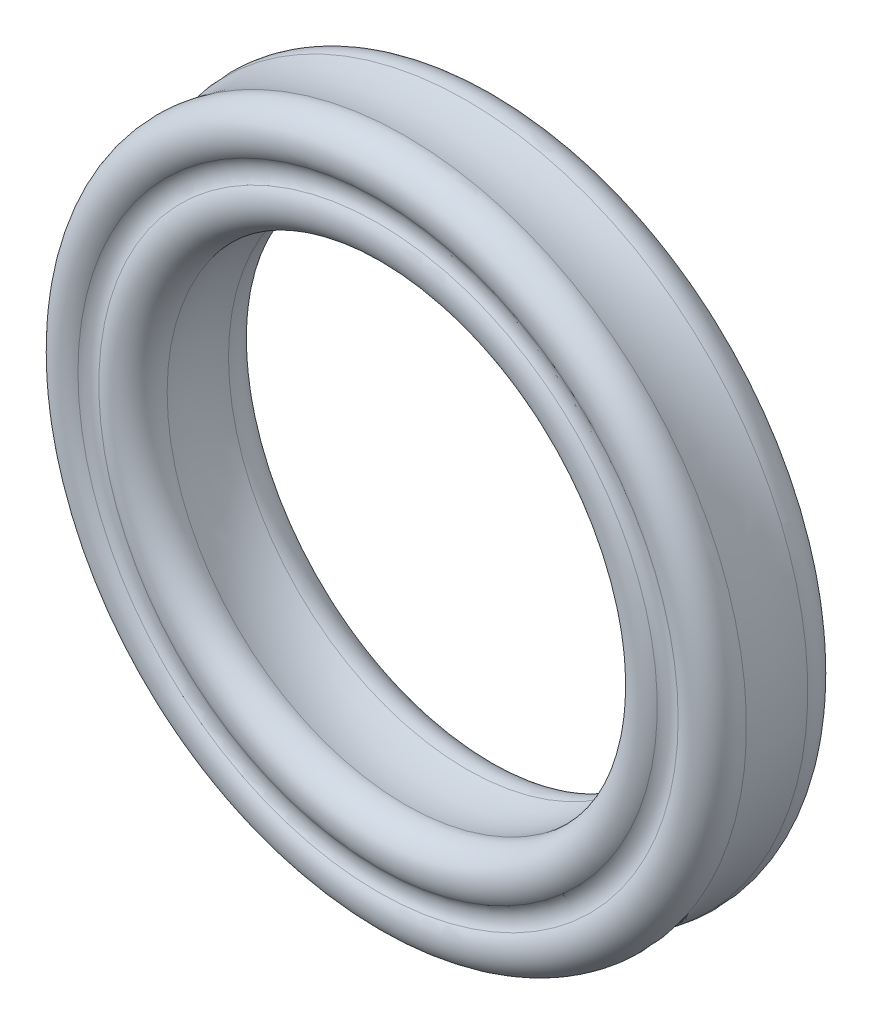
ISO-10303-21;
HEADER;
FILE_DESCRIPTION(('STEP AP214'),'2;1');
FILE_NAME('part.step','',(''),(''),'','','');
FILE_SCHEMA(('AUTOMOTIVE_DESIGN { 1 0 10303 214 1 1 1 1 }'));
ENDSEC;
DATA;
#1=APPLICATION_CONTEXT('core data for automotive mechanical design processes');
#2=APPLICATION_PROTOCOL_DEFINITION('international standard','automotive_design',2000,#1);
#3=PRODUCT_CONTEXT('',#1,'mechanical');
#4=PRODUCT('Part','Part','',(#3));
#5=PRODUCT_RELATED_PRODUCT_CATEGORY('part','',(#4));
#6=PRODUCT_DEFINITION_FORMATION('','',#4);
#7=PRODUCT_DEFINITION_CONTEXT('part definition',#1,'design');
#8=PRODUCT_DEFINITION('design','',#6,#7);
#9=PRODUCT_DEFINITION_SHAPE('','',#8);
#10=(LENGTH_UNIT() NAMED_UNIT(*) SI_UNIT(.MILLI.,.METRE.));
#11=(NAMED_UNIT(*) PLANE_ANGLE_UNIT() SI_UNIT($,.RADIAN.));
#12=(NAMED_UNIT(*) SI_UNIT($,.STERADIAN.) SOLID_ANGLE_UNIT());
#13=UNCERTAINTY_MEASURE_WITH_UNIT(LENGTH_MEASURE(1.E-05),#10,'distance_accuracy_value','');
#14=(GEOMETRIC_REPRESENTATION_CONTEXT(3) GLOBAL_UNCERTAINTY_ASSIGNED_CONTEXT((#13)) GLOBAL_UNIT_ASSIGNED_CONTEXT((#10,
#11,#12)) REPRESENTATION_CONTEXT('',''));
#15=CARTESIAN_POINT('',(0.,0.,0.));
#16=DIRECTION('',(0.,0.,1.));
#17=DIRECTION('',(1.,0.,0.));
#18=AXIS2_PLACEMENT_3D('',#15,#16,#17);
#19=CARTESIAN_POINT('',(0.,0.,0.199999999999999));
#20=DIRECTION('',(0.,0.,1.));
#21=DIRECTION('',(0.,-1.,0.));
#22=AXIS2_PLACEMENT_3D('',#19,#20,#21);
#23=TOROIDAL_SURFACE('',#22,6.65,0.4);
#24=CARTESIAN_POINT('',(0.,0.,-0.120000000000002));
#25=DIRECTION('',(0.,0.,1.));
#26=DIRECTION('',(0.,-1.,0.));
#27=AXIS2_PLACEMENT_3D('',#24,#25,#26);
#28=CIRCLE('',#27,6.41);
#29=CARTESIAN_POINT('',(0.,-6.41,-0.120000000000003));
#30=VERTEX_POINT('',#29);
#31=EDGE_CURVE('E10',#30,#30,#28,.T.);
#32=ORIENTED_EDGE('',*,*,#31,.F.);
#33=EDGE_LOOP('',(#32));
#34=FACE_BOUND('',#33,.T.);
#35=CARTESIAN_POINT('',(0.,0.,-0.120000000000002));
#36=DIRECTION('',(0.,0.,1.));
#37=DIRECTION('',(0.,-1.,0.));
#38=AXIS2_PLACEMENT_3D('',#35,#36,#37);
#39=CIRCLE('',#38,6.89);
#40=CARTESIAN_POINT('',(0.,-6.89,-0.120000000000003));
#41=VERTEX_POINT('',#40);
#42=EDGE_CURVE('E53',#41,#41,#39,.T.);
#43=ORIENTED_EDGE('',*,*,#42,.T.);
#44=EDGE_LOOP('',(#43));
#45=FACE_BOUND('',#44,.T.);
#46=ADVANCED_FACE('F25',(#34,#45),#23,.F.);
#47=CARTESIAN_POINT('',(0.,0.,-0.600000000000003));
#48=DIRECTION('',(0.,0.,1.));
#49=DIRECTION('',(0.,-1.,0.));
#50=AXIS2_PLACEMENT_3D('',#47,#48,#49);
#51=TOROIDAL_SURFACE('',#50,6.05,0.599999999999999);
#52=CARTESIAN_POINT('',(0.,0.,-0.745714285714287));
#53=DIRECTION('',(0.,0.,1.));
#54=DIRECTION('',(0.,-1.,0.));
#55=AXIS2_PLACEMENT_3D('',#52,#53,#54);
#56=CIRCLE('',#55,5.4679627615532);
#57=CARTESIAN_POINT('',(0.,-5.4679627615532,-0.745714285714288));
#58=VERTEX_POINT('',#57);
#59=EDGE_CURVE('E31',#58,#58,#56,.T.);
#60=ORIENTED_EDGE('',*,*,#59,.F.);
#61=EDGE_LOOP('',(#60));
#62=FACE_BOUND('',#61,.T.);
#63=ORIENTED_EDGE('',*,*,#31,.T.);
#64=EDGE_LOOP('',(#63));
#65=FACE_BOUND('',#64,.T.);
#66=ADVANCED_FACE('F90',(#62,#65),#51,.T.);
#67=CARTESIAN_POINT('',(0.,0.,-1.45));
#68=DIRECTION('',(0.,0.,1.));
#69=DIRECTION('',(0.,-1.,0.));
#70=AXIS2_PLACEMENT_3D('',#67,#68,#69);
#71=DEGENERATE_TOROIDAL_SURFACE('',#70,2.65478277572701,2.9,.T.);
#72=CARTESIAN_POINT('',(0.,0.,-2.15428571428572));
#73=DIRECTION('',(0.,0.,1.));
#74=DIRECTION('',(0.,-1.,0.));
#75=AXIS2_PLACEMENT_3D('',#72,#73,#74);
#76=CIRCLE('',#75,5.4679627615532);
#77=CARTESIAN_POINT('',(0.,-5.4679627615532,-2.15428571428572));
#78=VERTEX_POINT('',#77);
#79=EDGE_CURVE('E35',#78,#78,#76,.T.);
#80=ORIENTED_EDGE('',*,*,#79,.F.);
#81=EDGE_LOOP('',(#80));
#82=FACE_BOUND('',#81,.T.);
#83=ORIENTED_EDGE('',*,*,#59,.T.);
#84=EDGE_LOOP('',(#83));
#85=FACE_BOUND('',#84,.T.);
#86=ADVANCED_FACE('F85',(#82,#85),#71,.F.);
#87=CARTESIAN_POINT('',(0.,0.,-2.3));
#88=DIRECTION('',(0.,0.,1.));
#89=DIRECTION('',(0.,-1.,0.));
#90=AXIS2_PLACEMENT_3D('',#87,#88,#89);
#91=TOROIDAL_SURFACE('',#90,6.05,0.599999999999999);
#92=CARTESIAN_POINT('',(0.,0.,-2.78));
#93=DIRECTION('',(0.,0.,1.));
#94=DIRECTION('',(0.,-1.,0.));
#95=AXIS2_PLACEMENT_3D('',#92,#93,#94);
#96=CIRCLE('',#95,6.41);
#97=CARTESIAN_POINT('',(0.,-6.41,-2.78000000000001));
#98=VERTEX_POINT('',#97);
#99=EDGE_CURVE('E39',#98,#98,#96,.T.);
#100=ORIENTED_EDGE('',*,*,#99,.F.);
#101=EDGE_LOOP('',(#100));
#102=FACE_BOUND('',#101,.T.);
#103=ORIENTED_EDGE('',*,*,#79,.T.);
#104=EDGE_LOOP('',(#103));
#105=FACE_BOUND('',#104,.T.);
#106=ADVANCED_FACE('F79',(#102,#105),#91,.T.);
#107=CARTESIAN_POINT('',(0.,0.,-3.10000000000001));
#108=DIRECTION('',(0.,0.,1.));
#109=DIRECTION('',(0.,-1.,0.));
#110=AXIS2_PLACEMENT_3D('',#107,#108,#109);
#111=TOROIDAL_SURFACE('',#110,6.65,0.399999999999999);
#112=CARTESIAN_POINT('',(0.,0.,-2.78));
#113=DIRECTION('',(0.,0.,1.));
#114=DIRECTION('',(0.,-1.,0.));
#115=AXIS2_PLACEMENT_3D('',#112,#113,#114);
#116=CIRCLE('',#115,6.89);
#117=CARTESIAN_POINT('',(0.,-6.89,-2.78000000000001));
#118=VERTEX_POINT('',#117);
#119=EDGE_CURVE('E44',#118,#118,#116,.T.);
#120=ORIENTED_EDGE('',*,*,#119,.F.);
#121=EDGE_LOOP('',(#120));
#122=FACE_BOUND('',#121,.T.);
#123=ORIENTED_EDGE('',*,*,#99,.T.);
#124=EDGE_LOOP('',(#123));
#125=FACE_BOUND('',#124,.T.);
#126=ADVANCED_FACE('F73',(#122,#125),#111,.F.);
#127=CARTESIAN_POINT('',(0.,0.,-2.3));
#128=DIRECTION('',(0.,0.,1.));
#129=DIRECTION('',(0.,-1.,0.));
#130=AXIS2_PLACEMENT_3D('',#127,#128,#129);
#131=TOROIDAL_SURFACE('',#130,7.24999999999999,0.6);
#132=CARTESIAN_POINT('',(0.,0.,-2.15428571428572));
#133=DIRECTION('',(0.,0.,1.));
#134=DIRECTION('',(0.,-1.,0.));
#135=AXIS2_PLACEMENT_3D('',#132,#133,#134);
#136=CIRCLE('',#135,7.83203723844679);
#137=CARTESIAN_POINT('',(0.,-7.83203723844679,-2.15428571428572));
#138=VERTEX_POINT('',#137);
#139=EDGE_CURVE('E47',#138,#138,#136,.T.);
#140=ORIENTED_EDGE('',*,*,#139,.F.);
#141=EDGE_LOOP('',(#140));
#142=FACE_BOUND('',#141,.T.);
#143=ORIENTED_EDGE('',*,*,#119,.T.);
#144=EDGE_LOOP('',(#143));
#145=FACE_BOUND('',#144,.T.);
#146=ADVANCED_FACE('F67',(#142,#145),#131,.T.);
#147=CARTESIAN_POINT('',(0.,0.,-1.45));
#148=DIRECTION('',(0.,0.,1.));
#149=DIRECTION('',(0.,-1.,0.));
#150=AXIS2_PLACEMENT_3D('',#147,#148,#149);
#151=TOROIDAL_SURFACE('',#150,10.645217224273,2.9);
#152=CARTESIAN_POINT('',(0.,0.,-0.745714285714287));
#153=DIRECTION('',(0.,0.,1.));
#154=DIRECTION('',(0.,-1.,0.));
#155=AXIS2_PLACEMENT_3D('',#152,#153,#154);
#156=CIRCLE('',#155,7.83203723844679);
#157=CARTESIAN_POINT('',(0.,-7.83203723844679,-0.745714285714288));
#158=VERTEX_POINT('',#157);
#159=EDGE_CURVE('E50',#158,#158,#156,.T.);
#160=ORIENTED_EDGE('',*,*,#159,.F.);
#161=EDGE_LOOP('',(#160));
#162=FACE_BOUND('',#161,.T.);
#163=ORIENTED_EDGE('',*,*,#139,.T.);
#164=EDGE_LOOP('',(#163));
#165=FACE_BOUND('',#164,.T.);
#166=ADVANCED_FACE('F61',(#162,#165),#151,.F.);
#167=CARTESIAN_POINT('',(0.,0.,-0.600000000000003));
#168=DIRECTION('',(0.,0.,1.));
#169=DIRECTION('',(0.,-1.,0.));
#170=AXIS2_PLACEMENT_3D('',#167,#168,#169);
#171=TOROIDAL_SURFACE('',#170,7.24999999999999,0.599999999999999);
#172=ORIENTED_EDGE('',*,*,#42,.F.);
#173=EDGE_LOOP('',(#172));
#174=FACE_BOUND('',#173,.T.);
#175=ORIENTED_EDGE('',*,*,#159,.T.);
#176=EDGE_LOOP('',(#175));
#177=FACE_BOUND('',#176,.T.);
#178=ADVANCED_FACE('F58',(#174,#177),#171,.T.);
#179=CLOSED_SHELL('',(#46,#66,#86,#106,#126,#146,#166,#178));
#180=MANIFOLD_SOLID_BREP('B2',#179);
#181=ADVANCED_BREP_SHAPE_REPRESENTATION('',(#18,#180),#14);
#182=SHAPE_DEFINITION_REPRESENTATION(#9,#181);
ENDSEC;
END-ISO-10303-21;
